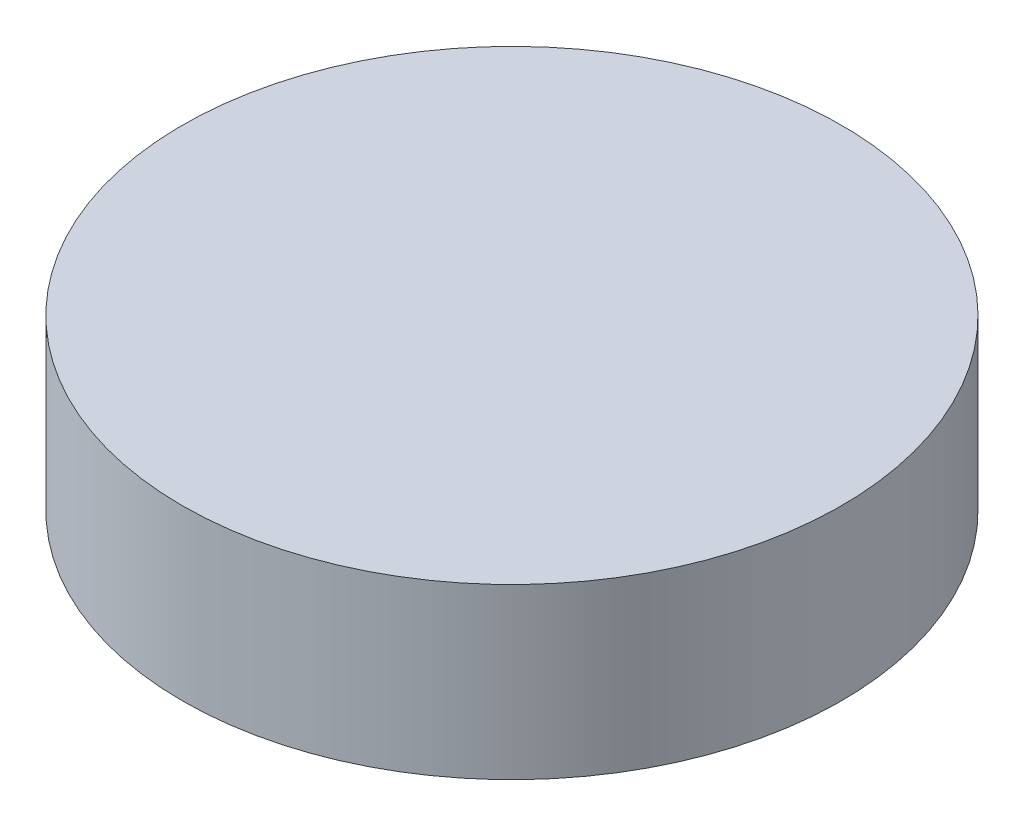
ISO-10303-21;
HEADER;
FILE_DESCRIPTION(('STEP AP214'),'2;1');
FILE_NAME('part.step','',(''),(''),'','','');
FILE_SCHEMA(('AUTOMOTIVE_DESIGN { 1 0 10303 214 1 1 1 1 }'));
ENDSEC;
DATA;
#1=APPLICATION_CONTEXT('core data for automotive mechanical design processes');
#2=APPLICATION_PROTOCOL_DEFINITION('international standard','automotive_design',2000,#1);
#3=PRODUCT_CONTEXT('',#1,'mechanical');
#4=PRODUCT('Part','Part','',(#3));
#5=PRODUCT_RELATED_PRODUCT_CATEGORY('part','',(#4));
#6=PRODUCT_DEFINITION_FORMATION('','',#4);
#7=PRODUCT_DEFINITION_CONTEXT('part definition',#1,'design');
#8=PRODUCT_DEFINITION('design','',#6,#7);
#9=PRODUCT_DEFINITION_SHAPE('','',#8);
#10=(LENGTH_UNIT() NAMED_UNIT(*) SI_UNIT(.MILLI.,.METRE.));
#11=(NAMED_UNIT(*) PLANE_ANGLE_UNIT() SI_UNIT($,.RADIAN.));
#12=(NAMED_UNIT(*) SI_UNIT($,.STERADIAN.) SOLID_ANGLE_UNIT());
#13=UNCERTAINTY_MEASURE_WITH_UNIT(LENGTH_MEASURE(1.E-05),#10,'distance_accuracy_value','');
#14=(GEOMETRIC_REPRESENTATION_CONTEXT(3) GLOBAL_UNCERTAINTY_ASSIGNED_CONTEXT((#13)) GLOBAL_UNIT_ASSIGNED_CONTEXT((#10,
#11,#12)) REPRESENTATION_CONTEXT('',''));
#15=CARTESIAN_POINT('',(0.,0.,0.));
#16=DIRECTION('',(0.,0.,1.));
#17=DIRECTION('',(1.,0.,0.));
#18=AXIS2_PLACEMENT_3D('',#15,#16,#17);
#19=CARTESIAN_POINT('',(0.,10.,0.));
#20=DIRECTION('',(0.,-1.,0.));
#21=DIRECTION('',(0.,0.,-1.));
#22=AXIS2_PLACEMENT_3D('',#19,#20,#21);
#23=CYLINDRICAL_SURFACE('',#22,19.5);
#24=CARTESIAN_POINT('',(0.,10.,0.));
#25=DIRECTION('',(0.,1.,0.));
#26=DIRECTION('',(0.,0.,1.));
#27=AXIS2_PLACEMENT_3D('',#24,#25,#26);
#28=CIRCLE('',#27,19.5);
#29=CARTESIAN_POINT('',(0.,10.,19.5));
#30=VERTEX_POINT('',#29);
#31=EDGE_CURVE('E10',#30,#30,#28,.T.);
#32=ORIENTED_EDGE('',*,*,#31,.F.);
#33=EDGE_LOOP('',(#32));
#34=FACE_BOUND('',#33,.T.);
#35=CARTESIAN_POINT('',(0.,0.,0.));
#36=DIRECTION('',(0.,1.,0.));
#37=DIRECTION('',(0.,0.,1.));
#38=AXIS2_PLACEMENT_3D('',#35,#36,#37);
#39=CIRCLE('',#38,19.5);
#40=CARTESIAN_POINT('',(0.,0.,19.5));
#41=VERTEX_POINT('',#40);
#42=EDGE_CURVE('E33',#41,#41,#39,.T.);
#43=ORIENTED_EDGE('',*,*,#42,.T.);
#44=EDGE_LOOP('',(#43));
#45=FACE_BOUND('',#44,.T.);
#46=ADVANCED_FACE('F30',(#34,#45),#23,.T.);
#47=CARTESIAN_POINT('',(0.,10.,0.));
#48=DIRECTION('',(0.,1.,0.));
#49=DIRECTION('',(0.,0.,1.));
#50=AXIS2_PLACEMENT_3D('',#47,#48,#49);
#51=PLANE('',#50);
#52=ORIENTED_EDGE('',*,*,#31,.T.);
#53=EDGE_LOOP('',(#52));
#54=FACE_BOUND('',#53,.T.);
#55=ADVANCED_FACE('F45',(#54),#51,.T.);
#56=CARTESIAN_POINT('',(0.,0.,0.));
#57=DIRECTION('',(0.,1.,0.));
#58=DIRECTION('',(0.,0.,1.));
#59=AXIS2_PLACEMENT_3D('',#56,#57,#58);
#60=PLANE('',#59);
#61=ORIENTED_EDGE('',*,*,#42,.F.);
#62=EDGE_LOOP('',(#61));
#63=FACE_BOUND('',#62,.T.);
#64=ADVANCED_FACE('F43',(#63),#60,.F.);
#65=CLOSED_SHELL('',(#46,#55,#64));
#66=MANIFOLD_SOLID_BREP('B2',#65);
#67=ADVANCED_BREP_SHAPE_REPRESENTATION('',(#18,#66),#14);
#68=SHAPE_DEFINITION_REPRESENTATION(#9,#67);
ENDSEC;
END-ISO-10303-21;
